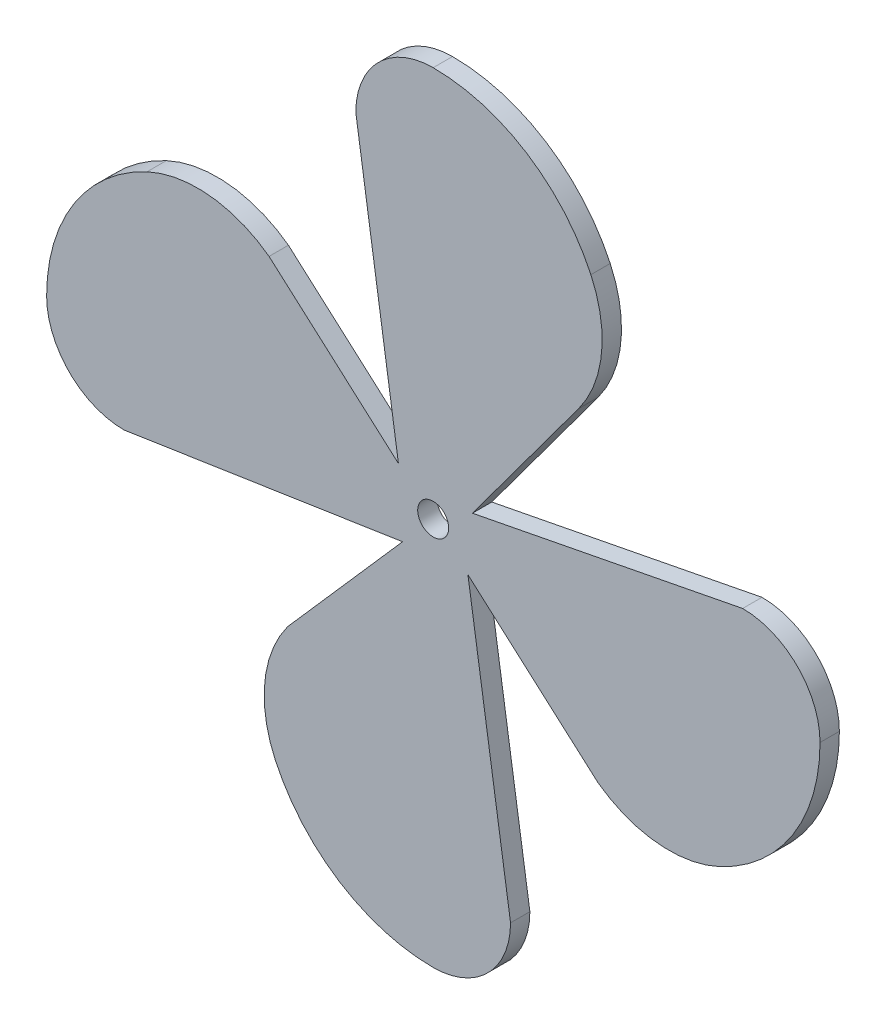
ISO-10303-21;
HEADER;
FILE_DESCRIPTION(('STEP AP214'),'2;1');
FILE_NAME('part.step','',(''),(''),'','','');
FILE_SCHEMA(('AUTOMOTIVE_DESIGN { 1 0 10303 214 1 1 1 1 }'));
ENDSEC;
DATA;
#1=APPLICATION_CONTEXT('core data for automotive mechanical design processes');
#2=APPLICATION_PROTOCOL_DEFINITION('international standard','automotive_design',2000,#1);
#3=PRODUCT_CONTEXT('',#1,'mechanical');
#4=PRODUCT('Part','Part','',(#3));
#5=PRODUCT_RELATED_PRODUCT_CATEGORY('part','',(#4));
#6=PRODUCT_DEFINITION_FORMATION('','',#4);
#7=PRODUCT_DEFINITION_CONTEXT('part definition',#1,'design');
#8=PRODUCT_DEFINITION('design','',#6,#7);
#9=PRODUCT_DEFINITION_SHAPE('','',#8);
#10=(LENGTH_UNIT() NAMED_UNIT(*) SI_UNIT(.MILLI.,.METRE.));
#11=(NAMED_UNIT(*) PLANE_ANGLE_UNIT() SI_UNIT($,.RADIAN.));
#12=(NAMED_UNIT(*) SI_UNIT($,.STERADIAN.) SOLID_ANGLE_UNIT());
#13=UNCERTAINTY_MEASURE_WITH_UNIT(LENGTH_MEASURE(1.E-05),#10,'distance_accuracy_value','');
#14=(GEOMETRIC_REPRESENTATION_CONTEXT(3) GLOBAL_UNCERTAINTY_ASSIGNED_CONTEXT((#13)) GLOBAL_UNIT_ASSIGNED_CONTEXT((#10,
#11,#12)) REPRESENTATION_CONTEXT('',''));
#15=CARTESIAN_POINT('',(0.,0.,0.));
#16=DIRECTION('',(0.,0.,1.));
#17=DIRECTION('',(1.,0.,0.));
#18=AXIS2_PLACEMENT_3D('',#15,#16,#17);
#19=CARTESIAN_POINT('',(3.50115267539276,-2.58802521543904,5.));
#20=DIRECTION('',(-0.804152348206515,0.594423250616888,0.));
#21=DIRECTION('',(-0.594423250616888,-0.804152348206515,0.));
#22=AXIS2_PLACEMENT_3D('',#19,#20,#21);
#23=PLANE('',#22);
#24=DIRECTION('',(0.594423250616888,0.804152348206515,0.));
#25=VECTOR('',#24,1.);
#26=CARTESIAN_POINT('',(3.50115267539276,-2.58802521543904,0.));
#27=LINE('',#26,#25);
#28=CARTESIAN_POINT('',(10.1481776949109,6.40425557520255,0.));
#29=VERTEX_POINT('',#28);
#30=CARTESIAN_POINT('',(37.6121465982581,43.5582785071412,0.));
#31=VERTEX_POINT('',#30);
#32=EDGE_CURVE('E206',#29,#31,#27,.T.);
#33=ORIENTED_EDGE('',*,*,#32,.T.);
#34=DIRECTION('',(0.,0.,-1.));
#35=VECTOR('',#34,1.);
#36=CARTESIAN_POINT('',(37.6121465982581,43.5582785071412,5.));
#37=LINE('',#36,#35);
#38=CARTESIAN_POINT('',(37.6121465982581,43.5582785071412,5.));
#39=VERTEX_POINT('',#38);
#40=EDGE_CURVE('E11',#39,#31,#37,.T.);
#41=ORIENTED_EDGE('',*,*,#40,.F.);
#42=DIRECTION('',(0.594423250616888,0.804152348206515,0.));
#43=VECTOR('',#42,1.);
#44=CARTESIAN_POINT('',(3.50115267539276,-2.58802521543904,5.));
#45=LINE('',#44,#43);
#46=CARTESIAN_POINT('',(10.1481776949109,6.40425557520255,5.));
#47=VERTEX_POINT('',#46);
#48=EDGE_CURVE('E253',#47,#39,#45,.T.);
#49=ORIENTED_EDGE('',*,*,#48,.F.);
#50=DIRECTION('',(0.,0.,-1.));
#51=VECTOR('',#50,1.);
#52=CARTESIAN_POINT('',(10.1481776949109,6.40425557520255,5.));
#53=LINE('',#52,#51);
#54=EDGE_CURVE('E49',#47,#29,#53,.T.);
#55=ORIENTED_EDGE('',*,*,#54,.T.);
#56=EDGE_LOOP('',(#33,#41,#49,#55));
#57=FACE_BOUND('',#56,.T.);
#58=ADVANCED_FACE('F33',(#57),#23,.F.);
#59=CARTESIAN_POINT('',(12.6834238038561,61.9853992762647,5.));
#60=DIRECTION('',(0.,0.,-1.));
#61=DIRECTION('',(-1.,0.,0.));
#62=AXIS2_PLACEMENT_3D('',#59,#60,#61);
#63=CYLINDRICAL_SURFACE('',#62,31.);
#64=CARTESIAN_POINT('',(12.6834238038561,61.9853992762647,0.));
#65=DIRECTION('',(0.,0.,1.));
#66=DIRECTION('',(1.,0.,0.));
#67=AXIS2_PLACEMENT_3D('',#64,#65,#66);
#68=CIRCLE('',#67,31.);
#69=CARTESIAN_POINT('',(40.7681479409661,75.1097381221809,0.));
#70=VERTEX_POINT('',#69);
#71=EDGE_CURVE('E208',#31,#70,#68,.T.);
#72=ORIENTED_EDGE('',*,*,#71,.T.);
#73=DIRECTION('',(0.,0.,-1.));
#74=VECTOR('',#73,1.);
#75=CARTESIAN_POINT('',(40.7681479409661,75.1097381221809,5.));
#76=LINE('',#75,#74);
#77=CARTESIAN_POINT('',(40.7681479409661,75.1097381221809,5.));
#78=VERTEX_POINT('',#77);
#79=EDGE_CURVE('E41',#78,#70,#76,.T.);
#80=ORIENTED_EDGE('',*,*,#79,.F.);
#81=CARTESIAN_POINT('',(12.6834238038561,61.9853992762647,5.));
#82=DIRECTION('',(0.,0.,1.));
#83=DIRECTION('',(1.,0.,0.));
#84=AXIS2_PLACEMENT_3D('',#81,#82,#83);
#85=CIRCLE('',#84,31.);
#86=EDGE_CURVE('E124',#39,#78,#85,.T.);
#87=ORIENTED_EDGE('',*,*,#86,.F.);
#88=ORIENTED_EDGE('',*,*,#40,.T.);
#89=EDGE_LOOP('',(#72,#80,#87,#88));
#90=FACE_BOUND('',#89,.T.);
#91=ADVANCED_FACE('F366',(#90),#63,.T.);
#92=CARTESIAN_POINT('',(0.,56.0582785071412,5.));
#93=DIRECTION('',(0.,0.,-1.));
#94=DIRECTION('',(-1.,0.,0.));
#95=AXIS2_PLACEMENT_3D('',#92,#93,#94);
#96=CYLINDRICAL_SURFACE('',#95,45.);
#97=CARTESIAN_POINT('',(0.,56.0582785071412,0.));
#98=DIRECTION('',(0.,0.,1.));
#99=DIRECTION('',(1.,0.,0.));
#100=AXIS2_PLACEMENT_3D('',#97,#98,#99);
#101=CIRCLE('',#100,45.);
#102=CARTESIAN_POINT('',(-1.79186594702441E-13,101.058278507141,0.));
#103=VERTEX_POINT('',#102);
#104=EDGE_CURVE('E210',#70,#103,#101,.T.);
#105=ORIENTED_EDGE('',*,*,#104,.T.);
#106=DIRECTION('',(0.,0.,-1.));
#107=VECTOR('',#106,1.);
#108=CARTESIAN_POINT('',(-1.79186594702441E-13,101.058278507141,5.));
#109=LINE('',#108,#107);
#110=CARTESIAN_POINT('',(-1.79186594702441E-13,101.058278507141,5.));
#111=VERTEX_POINT('',#110);
#112=EDGE_CURVE('E292',#111,#103,#109,.T.);
#113=ORIENTED_EDGE('',*,*,#112,.F.);
#114=CARTESIAN_POINT('',(0.,56.0582785071412,5.));
#115=DIRECTION('',(0.,0.,1.));
#116=DIRECTION('',(1.,0.,0.));
#117=AXIS2_PLACEMENT_3D('',#114,#115,#116);
#118=CIRCLE('',#117,45.);
#119=EDGE_CURVE('E300',#78,#111,#118,.T.);
#120=ORIENTED_EDGE('',*,*,#119,.F.);
#121=ORIENTED_EDGE('',*,*,#79,.T.);
#122=EDGE_LOOP('',(#105,#113,#120,#121));
#123=FACE_BOUND('',#122,.T.);
#124=ADVANCED_FACE('F298',(#123),#96,.T.);
#125=CARTESIAN_POINT('',(-1.80411241501588E-13,81.0582785071412,5.));
#126=DIRECTION('',(0.,0.,-1.));
#127=DIRECTION('',(-1.,0.,0.));
#128=AXIS2_PLACEMENT_3D('',#125,#126,#127);
#129=CYLINDRICAL_SURFACE('',#128,20.);
#130=CARTESIAN_POINT('',(-1.80411241501588E-13,81.0582785071412,0.));
#131=DIRECTION('',(0.,0.,1.));
#132=DIRECTION('',(1.,0.,0.));
#133=AXIS2_PLACEMENT_3D('',#130,#131,#132);
#134=CIRCLE('',#133,20.);
#135=CARTESIAN_POINT('',(-20.0000000000002,81.0582785071411,0.));
#136=VERTEX_POINT('',#135);
#137=EDGE_CURVE('E212',#103,#136,#134,.T.);
#138=ORIENTED_EDGE('',*,*,#137,.T.);
#139=DIRECTION('',(0.,0.,-1.));
#140=VECTOR('',#139,1.);
#141=CARTESIAN_POINT('',(-20.0000000000002,81.0582785071411,5.));
#142=LINE('',#141,#140);
#143=CARTESIAN_POINT('',(-20.0000000000002,81.0582785071411,5.));
#144=VERTEX_POINT('',#143);
#145=EDGE_CURVE('E289',#144,#136,#142,.T.);
#146=ORIENTED_EDGE('',*,*,#145,.F.);
#147=CARTESIAN_POINT('',(-1.80411241501588E-13,81.0582785071412,5.));
#148=DIRECTION('',(0.,0.,1.));
#149=DIRECTION('',(1.,0.,0.));
#150=AXIS2_PLACEMENT_3D('',#147,#148,#149);
#151=CIRCLE('',#150,20.);
#152=EDGE_CURVE('E318',#111,#144,#151,.T.);
#153=ORIENTED_EDGE('',*,*,#152,.F.);
#154=ORIENTED_EDGE('',*,*,#112,.T.);
#155=EDGE_LOOP('',(#138,#146,#153,#154));
#156=FACE_BOUND('',#155,.T.);
#157=ADVANCED_FACE('F308',(#156),#129,.T.);
#158=CARTESIAN_POINT('',(-7.60562070141994,-1.14672998043398,5.));
#159=DIRECTION('',(0.98882379098278,0.149088934486917,0.));
#160=DIRECTION('',(-0.149088934486917,0.98882379098278,0.));
#161=AXIS2_PLACEMENT_3D('',#158,#159,#160);
#162=PLANE('',#161);
#163=DIRECTION('',(0.149088934486918,-0.98882379098278,0.));
#164=VECTOR('',#163,1.);
#165=CARTESIAN_POINT('',(-7.60562070141994,-1.14672998043398,0.));
#166=LINE('',#165,#164);
#167=CARTESIAN_POINT('',(-8.97885478475092,7.96116616799044,0.));
#168=VERTEX_POINT('',#167);
#169=EDGE_CURVE('E214',#136,#168,#166,.T.);
#170=ORIENTED_EDGE('',*,*,#169,.T.);
#171=DIRECTION('',(0.,0.,-1.));
#172=VECTOR('',#171,1.);
#173=CARTESIAN_POINT('',(-8.97885478475092,7.96116616799044,5.));
#174=LINE('',#173,#172);
#175=CARTESIAN_POINT('',(-8.97885478475092,7.96116616799044,5.));
#176=VERTEX_POINT('',#175);
#177=EDGE_CURVE('E287',#176,#168,#174,.T.);
#178=ORIENTED_EDGE('',*,*,#177,.F.);
#179=DIRECTION('',(0.149088934486918,-0.98882379098278,0.));
#180=VECTOR('',#179,1.);
#181=CARTESIAN_POINT('',(-7.60562070141994,-1.14672998043398,5.));
#182=LINE('',#181,#180);
#183=EDGE_CURVE('E314',#144,#176,#182,.T.);
#184=ORIENTED_EDGE('',*,*,#183,.F.);
#185=ORIENTED_EDGE('',*,*,#145,.T.);
#186=EDGE_LOOP('',(#170,#178,#184,#185));
#187=FACE_BOUND('',#186,.T.);
#188=ADVANCED_FACE('F312',(#187),#162,.F.);
#189=CARTESIAN_POINT('',(0.,0.,5.));
#190=DIRECTION('',(0.663430513999203,0.748237898729243,0.));
#191=DIRECTION('',(-0.748237898729243,0.663430513999203,0.));
#192=AXIS2_PLACEMENT_3D('',#189,#190,#191);
#193=PLANE('',#192);
#194=DIRECTION('',(0.748237898729243,-0.663430513999203,0.));
#195=VECTOR('',#194,1.);
#196=CARTESIAN_POINT('',(0.,0.,0.));
#197=LINE('',#196,#195);
#198=CARTESIAN_POINT('',(-42.4201675134447,37.6121465982582,0.));
#199=VERTEX_POINT('',#198);
#200=EDGE_CURVE('E217',#199,#168,#197,.T.);
#201=ORIENTED_EDGE('',*,*,#200,.F.);
#202=DIRECTION('',(0.,0.,-1.));
#203=VECTOR('',#202,1.);
#204=CARTESIAN_POINT('',(-42.4201675134447,37.6121465982582,5.));
#205=LINE('',#204,#203);
#206=CARTESIAN_POINT('',(-42.4201675134447,37.6121465982582,5.));
#207=VERTEX_POINT('',#206);
#208=EDGE_CURVE('E285',#207,#199,#205,.T.);
#209=ORIENTED_EDGE('',*,*,#208,.F.);
#210=DIRECTION('',(0.748237898729243,-0.663430513999203,0.));
#211=VECTOR('',#210,1.);
#212=CARTESIAN_POINT('',(0.,0.,5.));
#213=LINE('',#212,#211);
#214=EDGE_CURVE('E317',#207,#176,#213,.T.);
#215=ORIENTED_EDGE('',*,*,#214,.T.);
#216=ORIENTED_EDGE('',*,*,#177,.T.);
#217=EDGE_LOOP('',(#201,#209,#215,#216));
#218=FACE_BOUND('',#217,.T.);
#219=ADVANCED_FACE('F382',(#218),#193,.T.);
#220=CARTESIAN_POINT('',(-60.8472882825682,12.6834238038561,5.));
#221=DIRECTION('',(0.,0.,-1.));
#222=DIRECTION('',(-1.,0.,0.));
#223=AXIS2_PLACEMENT_3D('',#220,#221,#222);
#224=CYLINDRICAL_SURFACE('',#223,31.0000000000001);
#225=CARTESIAN_POINT('',(-60.8472882825682,12.6834238038561,0.));
#226=DIRECTION('',(0.,0.,1.));
#227=DIRECTION('',(1.,0.,0.));
#228=AXIS2_PLACEMENT_3D('',#225,#226,#227);
#229=CIRCLE('',#228,31.0000000000001);
#230=CARTESIAN_POINT('',(-73.9716271284846,40.7681479409662,0.));
#231=VERTEX_POINT('',#230);
#232=EDGE_CURVE('E220',#199,#231,#229,.T.);
#233=ORIENTED_EDGE('',*,*,#232,.T.);
#234=DIRECTION('',(0.,0.,-1.));
#235=VECTOR('',#234,1.);
#236=CARTESIAN_POINT('',(-73.9716271284846,40.7681479409662,5.));
#237=LINE('',#236,#235);
#238=CARTESIAN_POINT('',(-73.9716271284846,40.7681479409662,5.));
#239=VERTEX_POINT('',#238);
#240=EDGE_CURVE('E282',#239,#231,#237,.T.);
#241=ORIENTED_EDGE('',*,*,#240,.F.);
#242=CARTESIAN_POINT('',(-60.8472882825682,12.6834238038561,5.));
#243=DIRECTION('',(0.,0.,1.));
#244=DIRECTION('',(1.,0.,0.));
#245=AXIS2_PLACEMENT_3D('',#242,#243,#244);
#246=CIRCLE('',#245,31.0000000000001);
#247=EDGE_CURVE('E320',#207,#239,#246,.T.);
#248=ORIENTED_EDGE('',*,*,#247,.F.);
#249=ORIENTED_EDGE('',*,*,#208,.T.);
#250=EDGE_LOOP('',(#233,#241,#248,#249));
#251=FACE_BOUND('',#250,.T.);
#252=ADVANCED_FACE('F385',(#251),#224,.T.);
#253=CARTESIAN_POINT('',(-54.9201675134447,0.,5.));
#254=DIRECTION('',(0.,0.,-1.));
#255=DIRECTION('',(-1.,0.,0.));
#256=AXIS2_PLACEMENT_3D('',#253,#254,#255);
#257=CYLINDRICAL_SURFACE('',#256,45.);
#258=CARTESIAN_POINT('',(-54.9201675134447,0.,0.));
#259=DIRECTION('',(0.,0.,1.));
#260=DIRECTION('',(1.,0.,0.));
#261=AXIS2_PLACEMENT_3D('',#258,#259,#260);
#262=CIRCLE('',#261,45.);
#263=CARTESIAN_POINT('',(-99.9201675134447,0.,0.));
#264=VERTEX_POINT('',#263);
#265=EDGE_CURVE('E222',#231,#264,#262,.T.);
#266=ORIENTED_EDGE('',*,*,#265,.T.);
#267=DIRECTION('',(0.,0.,-1.));
#268=VECTOR('',#267,1.);
#269=CARTESIAN_POINT('',(-99.9201675134447,0.,5.));
#270=LINE('',#269,#268);
#271=CARTESIAN_POINT('',(-99.9201675134447,0.,5.));
#272=VERTEX_POINT('',#271);
#273=EDGE_CURVE('E279',#272,#264,#270,.T.);
#274=ORIENTED_EDGE('',*,*,#273,.F.);
#275=CARTESIAN_POINT('',(-54.9201675134447,0.,5.));
#276=DIRECTION('',(0.,0.,1.));
#277=DIRECTION('',(1.,0.,0.));
#278=AXIS2_PLACEMENT_3D('',#275,#276,#277);
#279=CIRCLE('',#278,45.);
#280=EDGE_CURVE('E326',#239,#272,#279,.T.);
#281=ORIENTED_EDGE('',*,*,#280,.F.);
#282=ORIENTED_EDGE('',*,*,#240,.T.);
#283=EDGE_LOOP('',(#266,#274,#281,#282));
#284=FACE_BOUND('',#283,.T.);
#285=ADVANCED_FACE('F389',(#284),#257,.T.);
#286=CARTESIAN_POINT('',(-79.9201675134447,0.,5.));
#287=DIRECTION('',(0.,0.,-1.));
#288=DIRECTION('',(-1.,0.,0.));
#289=AXIS2_PLACEMENT_3D('',#286,#287,#288);
#290=CYLINDRICAL_SURFACE('',#289,20.);
#291=CARTESIAN_POINT('',(-79.9201675134447,0.,0.));
#292=DIRECTION('',(0.,0.,1.));
#293=DIRECTION('',(1.,0.,0.));
#294=AXIS2_PLACEMENT_3D('',#291,#292,#293);
#295=CIRCLE('',#294,20.);
#296=CARTESIAN_POINT('',(-79.9201675134432,-20.,0.));
#297=VERTEX_POINT('',#296);
#298=EDGE_CURVE('E224',#264,#297,#295,.T.);
#299=ORIENTED_EDGE('',*,*,#298,.T.);
#300=DIRECTION('',(0.,0.,-1.));
#301=VECTOR('',#300,1.);
#302=CARTESIAN_POINT('',(-79.9201675134432,-20.,5.));
#303=LINE('',#302,#301);
#304=CARTESIAN_POINT('',(-79.9201675134432,-20.,5.));
#305=VERTEX_POINT('',#304);
#306=EDGE_CURVE('E276',#305,#297,#303,.T.);
#307=ORIENTED_EDGE('',*,*,#306,.F.);
#308=CARTESIAN_POINT('',(-79.9201675134447,0.,5.));
#309=DIRECTION('',(0.,0.,1.));
#310=DIRECTION('',(1.,0.,0.));
#311=AXIS2_PLACEMENT_3D('',#308,#309,#310);
#312=CIRCLE('',#311,20.);
#313=EDGE_CURVE('E328',#272,#305,#312,.T.);
#314=ORIENTED_EDGE('',*,*,#313,.F.);
#315=ORIENTED_EDGE('',*,*,#273,.T.);
#316=EDGE_LOOP('',(#299,#307,#314,#315));
#317=FACE_BOUND('',#316,.T.);
#318=ADVANCED_FACE('F393',(#317),#290,.T.);
#319=CARTESIAN_POINT('',(1.16433281660708,-7.63554332931744,5.));
#320=DIRECTION('',(-0.150745977146287,0.988572531670899,0.));
#321=DIRECTION('',(-0.988572531670899,-0.150745977146287,0.));
#322=AXIS2_PLACEMENT_3D('',#319,#320,#321);
#323=PLANE('',#322);
#324=DIRECTION('',(0.988572531670899,0.150745977146287,0.));
#325=VECTOR('',#324,1.);
#326=CARTESIAN_POINT('',(1.16433281660708,-7.63554332931744,0.));
#327=LINE('',#326,#325);
#328=CARTESIAN_POINT('',(-7.91455322299064,-9.0199693613919,0.));
#329=VERTEX_POINT('',#328);
#330=EDGE_CURVE('E226',#297,#329,#327,.T.);
#331=ORIENTED_EDGE('',*,*,#330,.T.);
#332=DIRECTION('',(0.,0.,-1.));
#333=VECTOR('',#332,1.);
#334=CARTESIAN_POINT('',(-7.91455322299064,-9.0199693613919,5.));
#335=LINE('',#334,#333);
#336=CARTESIAN_POINT('',(-7.91455322299064,-9.0199693613919,5.));
#337=VERTEX_POINT('',#336);
#338=EDGE_CURVE('E274',#337,#329,#335,.T.);
#339=ORIENTED_EDGE('',*,*,#338,.F.);
#340=DIRECTION('',(0.988572531670899,0.150745977146287,0.));
#341=VECTOR('',#340,1.);
#342=CARTESIAN_POINT('',(1.16433281660708,-7.63554332931744,5.));
#343=LINE('',#342,#341);
#344=EDGE_CURVE('E330',#305,#337,#343,.T.);
#345=ORIENTED_EDGE('',*,*,#344,.F.);
#346=ORIENTED_EDGE('',*,*,#306,.T.);
#347=EDGE_LOOP('',(#331,#339,#345,#346));
#348=FACE_BOUND('',#347,.T.);
#349=ADVANCED_FACE('F397',(#348),#323,.F.);
#350=CARTESIAN_POINT('',(0.,0.,5.));
#351=DIRECTION('',(-0.751664113449325,0.659546101915887,0.));
#352=DIRECTION('',(-0.659546101915887,-0.751664113449325,0.));
#353=AXIS2_PLACEMENT_3D('',#350,#351,#352);
#354=PLANE('',#353);
#355=DIRECTION('',(0.659546101915887,0.751664113449325,0.));
#356=VECTOR('',#355,1.);
#357=CARTESIAN_POINT('',(0.,0.,0.));
#358=LINE('',#357,#356);
#359=CARTESIAN_POINT('',(-37.6121465982581,-42.8653899182793,0.));
#360=VERTEX_POINT('',#359);
#361=EDGE_CURVE('E229',#360,#329,#358,.T.);
#362=ORIENTED_EDGE('',*,*,#361,.F.);
#363=DIRECTION('',(0.,0.,-1.));
#364=VECTOR('',#363,1.);
#365=CARTESIAN_POINT('',(-37.6121465982581,-42.8653899182793,5.));
#366=LINE('',#365,#364);
#367=CARTESIAN_POINT('',(-37.6121465982581,-42.8653899182793,5.));
#368=VERTEX_POINT('',#367);
#369=EDGE_CURVE('E272',#368,#360,#366,.T.);
#370=ORIENTED_EDGE('',*,*,#369,.F.);
#371=DIRECTION('',(0.659546101915887,0.751664113449325,0.));
#372=VECTOR('',#371,1.);
#373=CARTESIAN_POINT('',(0.,0.,5.));
#374=LINE('',#373,#372);
#375=EDGE_CURVE('E332',#368,#337,#374,.T.);
#376=ORIENTED_EDGE('',*,*,#375,.T.);
#377=ORIENTED_EDGE('',*,*,#338,.T.);
#378=EDGE_LOOP('',(#362,#370,#376,#377));
#379=FACE_BOUND('',#378,.T.);
#380=ADVANCED_FACE('F401',(#379),#354,.T.);
#381=CARTESIAN_POINT('',(-12.6834238038561,-61.2925106874029,5.));
#382=DIRECTION('',(0.,0.,-1.));
#383=DIRECTION('',(-1.,0.,0.));
#384=AXIS2_PLACEMENT_3D('',#381,#382,#383);
#385=CYLINDRICAL_SURFACE('',#384,31.);
#386=CARTESIAN_POINT('',(-12.6834238038561,-61.2925106874029,0.));
#387=DIRECTION('',(0.,0.,1.));
#388=DIRECTION('',(1.,0.,0.));
#389=AXIS2_PLACEMENT_3D('',#386,#387,#388);
#390=CIRCLE('',#389,31.);
#391=CARTESIAN_POINT('',(-40.7681479409661,-74.4168495333194,0.));
#392=VERTEX_POINT('',#391);
#393=EDGE_CURVE('E232',#360,#392,#390,.T.);
#394=ORIENTED_EDGE('',*,*,#393,.T.);
#395=DIRECTION('',(0.,0.,-1.));
#396=VECTOR('',#395,1.);
#397=CARTESIAN_POINT('',(-40.7681479409661,-74.4168495333194,5.));
#398=LINE('',#397,#396);
#399=CARTESIAN_POINT('',(-40.7681479409661,-74.4168495333194,5.));
#400=VERTEX_POINT('',#399);
#401=EDGE_CURVE('E269',#400,#392,#398,.T.);
#402=ORIENTED_EDGE('',*,*,#401,.F.);
#403=CARTESIAN_POINT('',(-12.6834238038561,-61.2925106874029,5.));
#404=DIRECTION('',(0.,0.,1.));
#405=DIRECTION('',(1.,0.,0.));
#406=AXIS2_PLACEMENT_3D('',#403,#404,#405);
#407=CIRCLE('',#406,31.);
#408=EDGE_CURVE('E335',#368,#400,#407,.T.);
#409=ORIENTED_EDGE('',*,*,#408,.F.);
#410=ORIENTED_EDGE('',*,*,#369,.T.);
#411=EDGE_LOOP('',(#394,#402,#409,#410));
#412=FACE_BOUND('',#411,.T.);
#413=ADVANCED_FACE('F405',(#412),#385,.T.);
#414=CARTESIAN_POINT('',(0.,-55.3653899182793,5.));
#415=DIRECTION('',(0.,0.,-1.));
#416=DIRECTION('',(-1.,0.,0.));
#417=AXIS2_PLACEMENT_3D('',#414,#415,#416);
#418=CYLINDRICAL_SURFACE('',#417,45.);
#419=CARTESIAN_POINT('',(0.,-55.3653899182793,0.));
#420=DIRECTION('',(0.,0.,1.));
#421=DIRECTION('',(1.,0.,0.));
#422=AXIS2_PLACEMENT_3D('',#419,#420,#421);
#423=CIRCLE('',#422,45.);
#424=CARTESIAN_POINT('',(0.,-100.365389918279,0.));
#425=VERTEX_POINT('',#424);
#426=EDGE_CURVE('E234',#392,#425,#423,.T.);
#427=ORIENTED_EDGE('',*,*,#426,.T.);
#428=DIRECTION('',(0.,0.,-1.));
#429=VECTOR('',#428,1.);
#430=CARTESIAN_POINT('',(0.,-100.365389918279,5.));
#431=LINE('',#430,#429);
#432=CARTESIAN_POINT('',(0.,-100.365389918279,5.));
#433=VERTEX_POINT('',#432);
#434=EDGE_CURVE('E266',#433,#425,#431,.T.);
#435=ORIENTED_EDGE('',*,*,#434,.F.);
#436=CARTESIAN_POINT('',(0.,-55.3653899182793,5.));
#437=DIRECTION('',(0.,0.,1.));
#438=DIRECTION('',(1.,0.,0.));
#439=AXIS2_PLACEMENT_3D('',#436,#437,#438);
#440=CIRCLE('',#439,45.);
#441=EDGE_CURVE('E337',#400,#433,#440,.T.);
#442=ORIENTED_EDGE('',*,*,#441,.F.);
#443=ORIENTED_EDGE('',*,*,#401,.T.);
#444=EDGE_LOOP('',(#427,#435,#442,#443));
#445=FACE_BOUND('',#444,.T.);
#446=ADVANCED_FACE('F409',(#445),#418,.T.);
#447=CARTESIAN_POINT('',(0.,-80.3653899182793,5.));
#448=DIRECTION('',(0.,0.,-1.));
#449=DIRECTION('',(-1.,0.,0.));
#450=AXIS2_PLACEMENT_3D('',#447,#448,#449);
#451=CYLINDRICAL_SURFACE('',#450,20.);
#452=CARTESIAN_POINT('',(0.,-80.3653899182793,0.));
#453=DIRECTION('',(0.,0.,1.));
#454=DIRECTION('',(1.,0.,0.));
#455=AXIS2_PLACEMENT_3D('',#452,#453,#454);
#456=CIRCLE('',#455,20.);
#457=CARTESIAN_POINT('',(20.,-80.3653899182765,0.));
#458=VERTEX_POINT('',#457);
#459=EDGE_CURVE('E236',#425,#458,#456,.T.);
#460=ORIENTED_EDGE('',*,*,#459,.T.);
#461=DIRECTION('',(0.,0.,-1.));
#462=VECTOR('',#461,1.);
#463=CARTESIAN_POINT('',(20.,-80.3653899182765,5.));
#464=LINE('',#463,#462);
#465=CARTESIAN_POINT('',(20.,-80.3653899182765,5.));
#466=VERTEX_POINT('',#465);
#467=EDGE_CURVE('E263',#466,#458,#464,.T.);
#468=ORIENTED_EDGE('',*,*,#467,.F.);
#469=CARTESIAN_POINT('',(0.,-80.3653899182793,5.));
#470=DIRECTION('',(0.,0.,1.));
#471=DIRECTION('',(1.,0.,0.));
#472=AXIS2_PLACEMENT_3D('',#469,#470,#471);
#473=CIRCLE('',#472,20.);
#474=EDGE_CURVE('E339',#433,#466,#473,.T.);
#475=ORIENTED_EDGE('',*,*,#474,.F.);
#476=ORIENTED_EDGE('',*,*,#434,.T.);
#477=EDGE_LOOP('',(#460,#468,#475,#476));
#478=FACE_BOUND('',#477,.T.);
#479=ADVANCED_FACE('F413',(#478),#451,.T.);
#480=CARTESIAN_POINT('',(7.60085448148548,1.15606500001082,5.));
#481=DIRECTION('',(-0.988630185588045,-0.150367403861832,0.));
#482=DIRECTION('',(0.150367403861832,-0.988630185588045,0.));
#483=AXIS2_PLACEMENT_3D('',#480,#481,#482);
#484=PLANE('',#483);
#485=DIRECTION('',(-0.150367403861832,0.988630185588045,0.));
#486=VECTOR('',#485,1.);
#487=CARTESIAN_POINT('',(7.60085448148548,1.15606500001082,0.));
#488=LINE('',#487,#486);
#489=CARTESIAN_POINT('',(8.98628040895586,-7.95278343799303,0.));
#490=VERTEX_POINT('',#489);
#491=EDGE_CURVE('E238',#458,#490,#488,.T.);
#492=ORIENTED_EDGE('',*,*,#491,.T.);
#493=DIRECTION('',(0.,0.,-1.));
#494=VECTOR('',#493,1.);
#495=CARTESIAN_POINT('',(8.98628040895586,-7.95278343799303,5.));
#496=LINE('',#495,#494);
#497=CARTESIAN_POINT('',(8.98628040895586,-7.95278343799303,5.));
#498=VERTEX_POINT('',#497);
#499=EDGE_CURVE('E260',#498,#490,#496,.T.);
#500=ORIENTED_EDGE('',*,*,#499,.F.);
#501=DIRECTION('',(-0.150367403861832,0.988630185588045,0.));
#502=VECTOR('',#501,1.);
#503=CARTESIAN_POINT('',(7.60085448148548,1.15606500001082,5.));
#504=LINE('',#503,#502);
#505=EDGE_CURVE('E341',#466,#498,#504,.T.);
#506=ORIENTED_EDGE('',*,*,#505,.F.);
#507=ORIENTED_EDGE('',*,*,#467,.T.);
#508=EDGE_LOOP('',(#492,#500,#506,#507));
#509=FACE_BOUND('',#508,.T.);
#510=ADVANCED_FACE('F417',(#509),#484,.F.);
#511=CARTESIAN_POINT('',(0.,0.,5.));
#512=DIRECTION('',(0.662731953166085,0.748856700746322,0.));
#513=DIRECTION('',(-0.748856700746322,0.662731953166085,0.));
#514=AXIS2_PLACEMENT_3D('',#511,#512,#513);
#515=PLANE('',#514);
#516=DIRECTION('',(0.748856700746322,-0.662731953166085,0.));
#517=VECTOR('',#516,1.);
#518=CARTESIAN_POINT('',(0.,0.,0.));
#519=LINE('',#518,#517);
#520=CARTESIAN_POINT('',(42.5,-37.6121465982582,0.));
#521=VERTEX_POINT('',#520);
#522=EDGE_CURVE('E240',#490,#521,#519,.T.);
#523=ORIENTED_EDGE('',*,*,#522,.T.);
#524=DIRECTION('',(0.,0.,-1.));
#525=VECTOR('',#524,1.);
#526=CARTESIAN_POINT('',(42.5,-37.6121465982582,5.));
#527=LINE('',#526,#525);
#528=CARTESIAN_POINT('',(42.5,-37.6121465982582,5.));
#529=VERTEX_POINT('',#528);
#530=EDGE_CURVE('E257',#529,#521,#527,.T.);
#531=ORIENTED_EDGE('',*,*,#530,.F.);
#532=DIRECTION('',(0.748856700746322,-0.662731953166085,0.));
#533=VECTOR('',#532,1.);
#534=CARTESIAN_POINT('',(0.,0.,5.));
#535=LINE('',#534,#533);
#536=EDGE_CURVE('E343',#498,#529,#535,.T.);
#537=ORIENTED_EDGE('',*,*,#536,.F.);
#538=ORIENTED_EDGE('',*,*,#499,.T.);
#539=EDGE_LOOP('',(#523,#531,#537,#538));
#540=FACE_BOUND('',#539,.T.);
#541=ADVANCED_FACE('F349',(#540),#515,.F.);
#542=CARTESIAN_POINT('',(60.9271207691235,-12.6834238038562,5.));
#543=DIRECTION('',(0.,0.,-1.));
#544=DIRECTION('',(-1.,0.,0.));
#545=AXIS2_PLACEMENT_3D('',#542,#543,#544);
#546=CYLINDRICAL_SURFACE('',#545,31.);
#547=CARTESIAN_POINT('',(60.9271207691235,-12.6834238038562,0.));
#548=DIRECTION('',(0.,0.,1.));
#549=DIRECTION('',(1.,0.,0.));
#550=AXIS2_PLACEMENT_3D('',#547,#548,#549);
#551=CIRCLE('',#550,31.);
#552=CARTESIAN_POINT('',(74.0514596150396,-40.7681479409663,0.));
#553=VERTEX_POINT('',#552);
#554=EDGE_CURVE('E242',#521,#553,#551,.T.);
#555=ORIENTED_EDGE('',*,*,#554,.T.);
#556=DIRECTION('',(0.,0.,-1.));
#557=VECTOR('',#556,1.);
#558=CARTESIAN_POINT('',(74.0514596150396,-40.7681479409663,5.));
#559=LINE('',#558,#557);
#560=CARTESIAN_POINT('',(74.0514596150396,-40.7681479409663,5.));
#561=VERTEX_POINT('',#560);
#562=EDGE_CURVE('E195',#561,#553,#559,.T.);
#563=ORIENTED_EDGE('',*,*,#562,.F.);
#564=CARTESIAN_POINT('',(60.9271207691235,-12.6834238038562,5.));
#565=DIRECTION('',(0.,0.,1.));
#566=DIRECTION('',(1.,0.,0.));
#567=AXIS2_PLACEMENT_3D('',#564,#565,#566);
#568=CIRCLE('',#567,31.);
#569=EDGE_CURVE('E183',#529,#561,#568,.T.);
#570=ORIENTED_EDGE('',*,*,#569,.F.);
#571=ORIENTED_EDGE('',*,*,#530,.T.);
#572=EDGE_LOOP('',(#555,#563,#570,#571));
#573=FACE_BOUND('',#572,.T.);
#574=ADVANCED_FACE('F353',(#573),#546,.T.);
#575=CARTESIAN_POINT('',(55.,0.,5.));
#576=DIRECTION('',(0.,0.,-1.));
#577=DIRECTION('',(-1.,0.,0.));
#578=AXIS2_PLACEMENT_3D('',#575,#576,#577);
#579=CYLINDRICAL_SURFACE('',#578,45.);
#580=CARTESIAN_POINT('',(55.,0.,0.));
#581=DIRECTION('',(0.,0.,1.));
#582=DIRECTION('',(1.,0.,0.));
#583=AXIS2_PLACEMENT_3D('',#580,#581,#582);
#584=CIRCLE('',#583,45.);
#585=CARTESIAN_POINT('',(100.,0.,0.));
#586=VERTEX_POINT('',#585);
#587=EDGE_CURVE('E192',#553,#586,#584,.T.);
#588=ORIENTED_EDGE('',*,*,#587,.T.);
#589=DIRECTION('',(0.,0.,-1.));
#590=VECTOR('',#589,1.);
#591=CARTESIAN_POINT('',(100.,0.,5.));
#592=LINE('',#591,#590);
#593=CARTESIAN_POINT('',(100.,0.,5.));
#594=VERTEX_POINT('',#593);
#595=EDGE_CURVE('E189',#594,#586,#592,.T.);
#596=ORIENTED_EDGE('',*,*,#595,.F.);
#597=CARTESIAN_POINT('',(55.,0.,5.));
#598=DIRECTION('',(0.,0.,1.));
#599=DIRECTION('',(1.,0.,0.));
#600=AXIS2_PLACEMENT_3D('',#597,#598,#599);
#601=CIRCLE('',#600,45.);
#602=EDGE_CURVE('E175',#561,#594,#601,.T.);
#603=ORIENTED_EDGE('',*,*,#602,.F.);
#604=ORIENTED_EDGE('',*,*,#562,.T.);
#605=EDGE_LOOP('',(#588,#596,#603,#604));
#606=FACE_BOUND('',#605,.T.);
#607=ADVANCED_FACE('F190',(#606),#579,.T.);
#608=CARTESIAN_POINT('',(80.,0.,5.));
#609=DIRECTION('',(0.,0.,-1.));
#610=DIRECTION('',(-1.,0.,0.));
#611=AXIS2_PLACEMENT_3D('',#608,#609,#610);
#612=CYLINDRICAL_SURFACE('',#611,20.);
#613=CARTESIAN_POINT('',(80.,0.,0.));
#614=DIRECTION('',(0.,0.,1.));
#615=DIRECTION('',(1.,0.,0.));
#616=AXIS2_PLACEMENT_3D('',#613,#614,#615);
#617=CIRCLE('',#616,20.);
#618=CARTESIAN_POINT('',(80.,20.,0.));
#619=VERTEX_POINT('',#618);
#620=EDGE_CURVE('E245',#586,#619,#617,.T.);
#621=ORIENTED_EDGE('',*,*,#620,.T.);
#622=DIRECTION('',(0.,0.,-1.));
#623=VECTOR('',#622,1.);
#624=CARTESIAN_POINT('',(80.,20.,5.));
#625=LINE('',#624,#623);
#626=CARTESIAN_POINT('',(80.,20.,5.));
#627=VERTEX_POINT('',#626);
#628=EDGE_CURVE('E112',#627,#619,#625,.T.);
#629=ORIENTED_EDGE('',*,*,#628,.F.);
#630=CARTESIAN_POINT('',(80.,0.,5.));
#631=DIRECTION('',(0.,0.,1.));
#632=DIRECTION('',(1.,0.,0.));
#633=AXIS2_PLACEMENT_3D('',#630,#631,#632);
#634=CIRCLE('',#633,20.);
#635=EDGE_CURVE('E181',#594,#627,#634,.T.);
#636=ORIENTED_EDGE('',*,*,#635,.F.);
#637=ORIENTED_EDGE('',*,*,#595,.T.);
#638=EDGE_LOOP('',(#621,#629,#636,#637));
#639=FACE_BOUND('',#638,.T.);
#640=ADVANCED_FACE('F197',(#639),#612,.T.);
#641=CARTESIAN_POINT('',(-0.830590119973653,4.26738188480081,5.));
#642=DIRECTION('',(-0.191051714859867,0.981579972416463,0.));
#643=DIRECTION('',(-0.981579972416463,-0.191051714859867,0.));
#644=AXIS2_PLACEMENT_3D('',#641,#642,#643);
#645=PLANE('',#644);
#646=DIRECTION('',(0.981579972416463,0.191051714859867,0.));
#647=VECTOR('',#646,1.);
#648=CARTESIAN_POINT('',(-0.830590119973653,4.26738188480081,0.));
#649=LINE('',#648,#647);
#650=EDGE_CURVE('E247',#29,#619,#649,.T.);
#651=ORIENTED_EDGE('',*,*,#650,.F.);
#652=ORIENTED_EDGE('',*,*,#54,.F.);
#653=DIRECTION('',(0.981579972416463,0.191051714859867,0.));
#654=VECTOR('',#653,1.);
#655=CARTESIAN_POINT('',(-0.830590119973653,4.26738188480081,5.));
#656=LINE('',#655,#654);
#657=EDGE_CURVE('E198',#47,#627,#656,.T.);
#658=ORIENTED_EDGE('',*,*,#657,.T.);
#659=ORIENTED_EDGE('',*,*,#628,.T.);
#660=EDGE_LOOP('',(#651,#652,#658,#659));
#661=FACE_BOUND('',#660,.T.);
#662=ADVANCED_FACE('F354',(#661),#645,.T.);
#663=CARTESIAN_POINT('',(0.,0.,5.));
#664=DIRECTION('',(0.,0.,-1.));
#665=DIRECTION('',(-1.,0.,0.));
#666=AXIS2_PLACEMENT_3D('',#663,#664,#665);
#667=CYLINDRICAL_SURFACE('',#666,4.);
#668=CARTESIAN_POINT('',(0.,0.,5.));
#669=DIRECTION('',(0.,0.,1.));
#670=DIRECTION('',(1.,0.,0.));
#671=AXIS2_PLACEMENT_3D('',#668,#669,#670);
#672=CIRCLE('',#671,4.);
#673=CARTESIAN_POINT('',(4.,0.,5.));
#674=VERTEX_POINT('',#673);
#675=EDGE_CURVE('E200',#674,#674,#672,.T.);
#676=ORIENTED_EDGE('',*,*,#675,.T.);
#677=EDGE_LOOP('',(#676));
#678=FACE_BOUND('',#677,.T.);
#679=CARTESIAN_POINT('',(0.,0.,0.));
#680=DIRECTION('',(0.,0.,1.));
#681=DIRECTION('',(1.,0.,0.));
#682=AXIS2_PLACEMENT_3D('',#679,#680,#681);
#683=CIRCLE('',#682,4.);
#684=CARTESIAN_POINT('',(4.,0.,0.));
#685=VERTEX_POINT('',#684);
#686=EDGE_CURVE('E250',#685,#685,#683,.T.);
#687=ORIENTED_EDGE('',*,*,#686,.F.);
#688=EDGE_LOOP('',(#687));
#689=FACE_BOUND('',#688,.T.);
#690=ADVANCED_FACE('F356',(#678,#689),#667,.F.);
#691=CARTESIAN_POINT('',(0.,0.,5.));
#692=DIRECTION('',(0.,0.,1.));
#693=DIRECTION('',(1.,0.,0.));
#694=AXIS2_PLACEMENT_3D('',#691,#692,#693);
#695=PLANE('',#694);
#696=ORIENTED_EDGE('',*,*,#48,.T.);
#697=ORIENTED_EDGE('',*,*,#86,.T.);
#698=ORIENTED_EDGE('',*,*,#119,.T.);
#699=ORIENTED_EDGE('',*,*,#152,.T.);
#700=ORIENTED_EDGE('',*,*,#183,.T.);
#701=ORIENTED_EDGE('',*,*,#214,.F.);
#702=ORIENTED_EDGE('',*,*,#247,.T.);
#703=ORIENTED_EDGE('',*,*,#280,.T.);
#704=ORIENTED_EDGE('',*,*,#313,.T.);
#705=ORIENTED_EDGE('',*,*,#344,.T.);
#706=ORIENTED_EDGE('',*,*,#375,.F.);
#707=ORIENTED_EDGE('',*,*,#408,.T.);
#708=ORIENTED_EDGE('',*,*,#441,.T.);
#709=ORIENTED_EDGE('',*,*,#474,.T.);
#710=ORIENTED_EDGE('',*,*,#505,.T.);
#711=ORIENTED_EDGE('',*,*,#536,.T.);
#712=ORIENTED_EDGE('',*,*,#569,.T.);
#713=ORIENTED_EDGE('',*,*,#602,.T.);
#714=ORIENTED_EDGE('',*,*,#635,.T.);
#715=ORIENTED_EDGE('',*,*,#657,.F.);
#716=EDGE_LOOP('',(#696,#697,#698,#699,#700,#701,#702,#703,#704,#705,#706,#707,#708,#709,#710,
#711,#712,#713,#714,#715));
#717=FACE_BOUND('',#716,.T.);
#718=ORIENTED_EDGE('',*,*,#675,.F.);
#719=EDGE_LOOP('',(#718));
#720=FACE_BOUND('',#719,.T.);
#721=ADVANCED_FACE('F177',(#717,#720),#695,.T.);
#722=CARTESIAN_POINT('',(0.,0.,0.));
#723=DIRECTION('',(0.,0.,1.));
#724=DIRECTION('',(1.,0.,0.));
#725=AXIS2_PLACEMENT_3D('',#722,#723,#724);
#726=PLANE('',#725);
#727=ORIENTED_EDGE('',*,*,#32,.F.);
#728=ORIENTED_EDGE('',*,*,#650,.T.);
#729=ORIENTED_EDGE('',*,*,#620,.F.);
#730=ORIENTED_EDGE('',*,*,#587,.F.);
#731=ORIENTED_EDGE('',*,*,#554,.F.);
#732=ORIENTED_EDGE('',*,*,#522,.F.);
#733=ORIENTED_EDGE('',*,*,#491,.F.);
#734=ORIENTED_EDGE('',*,*,#459,.F.);
#735=ORIENTED_EDGE('',*,*,#426,.F.);
#736=ORIENTED_EDGE('',*,*,#393,.F.);
#737=ORIENTED_EDGE('',*,*,#361,.T.);
#738=ORIENTED_EDGE('',*,*,#330,.F.);
#739=ORIENTED_EDGE('',*,*,#298,.F.);
#740=ORIENTED_EDGE('',*,*,#265,.F.);
#741=ORIENTED_EDGE('',*,*,#232,.F.);
#742=ORIENTED_EDGE('',*,*,#200,.T.);
#743=ORIENTED_EDGE('',*,*,#169,.F.);
#744=ORIENTED_EDGE('',*,*,#137,.F.);
#745=ORIENTED_EDGE('',*,*,#104,.F.);
#746=ORIENTED_EDGE('',*,*,#71,.F.);
#747=EDGE_LOOP('',(#727,#728,#729,#730,#731,#732,#733,#734,#735,#736,#737,#738,#739,#740,#741,
#742,#743,#744,#745,#746));
#748=FACE_BOUND('',#747,.T.);
#749=ORIENTED_EDGE('',*,*,#686,.T.);
#750=EDGE_LOOP('',(#749));
#751=FACE_BOUND('',#750,.T.);
#752=ADVANCED_FACE('F303',(#748,#751),#726,.F.);
#753=CLOSED_SHELL('',(#58,#91,#124,#157,#188,#219,#252,#285,#318,#349,#380,#413,#446,#479,#510,
#541,#574,#607,#640,#662,#690,#721,#752));
#754=MANIFOLD_SOLID_BREP('B2',#753);
#755=ADVANCED_BREP_SHAPE_REPRESENTATION('',(#18,#754),#14);
#756=SHAPE_DEFINITION_REPRESENTATION(#9,#755);
ENDSEC;
END-ISO-10303-21;
